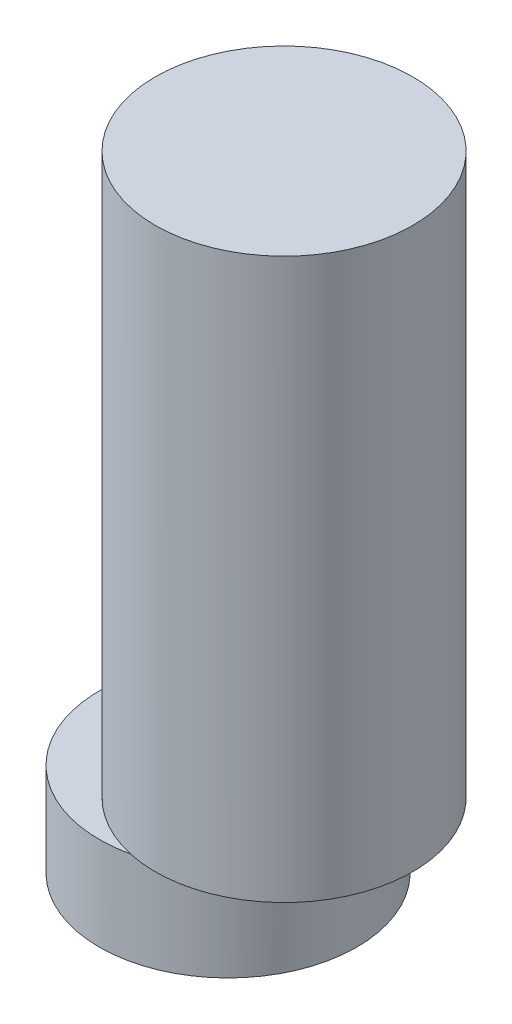
ISO-10303-21;
HEADER;
FILE_DESCRIPTION(('STEP AP214'),'2;1');
FILE_NAME('part.step','',(''),(''),'','','');
FILE_SCHEMA(('AUTOMOTIVE_DESIGN { 1 0 10303 214 1 1 1 1 }'));
ENDSEC;
DATA;
#1=APPLICATION_CONTEXT('core data for automotive mechanical design processes');
#2=APPLICATION_PROTOCOL_DEFINITION('international standard','automotive_design',2000,#1);
#3=PRODUCT_CONTEXT('',#1,'mechanical');
#4=PRODUCT('Part','Part','',(#3));
#5=PRODUCT_RELATED_PRODUCT_CATEGORY('part','',(#4));
#6=PRODUCT_DEFINITION_FORMATION('','',#4);
#7=PRODUCT_DEFINITION_CONTEXT('part definition',#1,'design');
#8=PRODUCT_DEFINITION('design','',#6,#7);
#9=PRODUCT_DEFINITION_SHAPE('','',#8);
#10=(LENGTH_UNIT() NAMED_UNIT(*) SI_UNIT(.MILLI.,.METRE.));
#11=(NAMED_UNIT(*) PLANE_ANGLE_UNIT() SI_UNIT($,.RADIAN.));
#12=(NAMED_UNIT(*) SI_UNIT($,.STERADIAN.) SOLID_ANGLE_UNIT());
#13=UNCERTAINTY_MEASURE_WITH_UNIT(LENGTH_MEASURE(1.E-05),#10,'distance_accuracy_value','');
#14=(GEOMETRIC_REPRESENTATION_CONTEXT(3) GLOBAL_UNCERTAINTY_ASSIGNED_CONTEXT((#13)) GLOBAL_UNIT_ASSIGNED_CONTEXT((#10,
#11,#12)) REPRESENTATION_CONTEXT('',''));
#15=CARTESIAN_POINT('',(0.,0.,0.));
#16=DIRECTION('',(0.,0.,1.));
#17=DIRECTION('',(1.,0.,0.));
#18=AXIS2_PLACEMENT_3D('',#15,#16,#17);
#19=CARTESIAN_POINT('',(0.,2.5,0.));
#20=DIRECTION('',(0.,-1.,0.));
#21=DIRECTION('',(0.,0.,-1.));
#22=AXIS2_PLACEMENT_3D('',#19,#20,#21);
#23=CYLINDRICAL_SURFACE('',#22,3.45);
#24=CARTESIAN_POINT('',(0.,2.5,0.));
#25=DIRECTION('',(0.,1.,0.));
#26=DIRECTION('',(0.,0.,1.));
#27=AXIS2_PLACEMENT_3D('',#24,#25,#26);
#28=CIRCLE('',#27,3.45);
#29=CARTESIAN_POINT('',(0.749999999999999,2.5,3.36749164809655));
#30=VERTEX_POINT('',#29);
#31=CARTESIAN_POINT('',(0.749999999999999,2.5,-3.36749164809655));
#32=VERTEX_POINT('',#31);
#33=EDGE_CURVE('E11',#30,#32,#28,.T.);
#34=ORIENTED_EDGE('',*,*,#33,.F.);
#35=EDGE_CURVE('E52',#32,#30,#28,.T.);
#36=ORIENTED_EDGE('',*,*,#35,.F.);
#37=EDGE_LOOP('',(#34,#36));
#38=FACE_BOUND('',#37,.T.);
#39=CARTESIAN_POINT('',(0.,0.,0.));
#40=DIRECTION('',(0.,1.,0.));
#41=DIRECTION('',(0.,0.,1.));
#42=AXIS2_PLACEMENT_3D('',#39,#40,#41);
#43=CIRCLE('',#42,3.45);
#44=CARTESIAN_POINT('',(0.,0.,3.45));
#45=VERTEX_POINT('',#44);
#46=EDGE_CURVE('E46',#45,#45,#43,.T.);
#47=ORIENTED_EDGE('',*,*,#46,.T.);
#48=EDGE_LOOP('',(#47));
#49=FACE_BOUND('',#48,.T.);
#50=ADVANCED_FACE('F43',(#38,#49),#23,.T.);
#51=CARTESIAN_POINT('',(0.,2.5,0.));
#52=DIRECTION('',(0.,1.,0.));
#53=DIRECTION('',(0.,0.,1.));
#54=AXIS2_PLACEMENT_3D('',#51,#52,#53);
#55=PLANE('',#54);
#56=CARTESIAN_POINT('',(1.5,2.5,0.));
#57=DIRECTION('',(0.,1.,0.));
#58=DIRECTION('',(0.,0.,1.));
#59=AXIS2_PLACEMENT_3D('',#56,#57,#58);
#60=CIRCLE('',#59,3.45);
#61=EDGE_CURVE('E58',#32,#30,#60,.T.);
#62=ORIENTED_EDGE('',*,*,#61,.F.);
#63=ORIENTED_EDGE('',*,*,#35,.T.);
#64=EDGE_LOOP('',(#62,#63));
#65=FACE_BOUND('',#64,.T.);
#66=ADVANCED_FACE('F66',(#65),#55,.T.);
#67=CARTESIAN_POINT('',(0.,0.,0.));
#68=DIRECTION('',(0.,1.,0.));
#69=DIRECTION('',(0.,0.,1.));
#70=AXIS2_PLACEMENT_3D('',#67,#68,#69);
#71=PLANE('',#70);
#72=ORIENTED_EDGE('',*,*,#46,.F.);
#73=EDGE_LOOP('',(#72));
#74=FACE_BOUND('',#73,.T.);
#75=ADVANCED_FACE('F85',(#74),#71,.F.);
#76=CARTESIAN_POINT('',(1.5,2.5,0.));
#77=DIRECTION('',(0.,1.,0.));
#78=DIRECTION('',(0.,0.,1.));
#79=AXIS2_PLACEMENT_3D('',#76,#77,#78);
#80=PLANE('',#79);
#81=EDGE_CURVE('E68',#30,#32,#60,.T.);
#82=ORIENTED_EDGE('',*,*,#81,.F.);
#83=ORIENTED_EDGE('',*,*,#33,.T.);
#84=EDGE_LOOP('',(#82,#83));
#85=FACE_BOUND('',#84,.T.);
#86=ADVANCED_FACE('F69',(#85),#80,.F.);
#87=CARTESIAN_POINT('',(1.5,17.5,0.));
#88=DIRECTION('',(0.,-1.,0.));
#89=DIRECTION('',(0.,0.,-1.));
#90=AXIS2_PLACEMENT_3D('',#87,#88,#89);
#91=CYLINDRICAL_SURFACE('',#90,3.45);
#92=CARTESIAN_POINT('',(1.5,17.5,0.));
#93=DIRECTION('',(0.,1.,0.));
#94=DIRECTION('',(0.,0.,1.));
#95=AXIS2_PLACEMENT_3D('',#92,#93,#94);
#96=CIRCLE('',#95,3.45);
#97=CARTESIAN_POINT('',(1.5,17.5,3.45));
#98=VERTEX_POINT('',#97);
#99=EDGE_CURVE('E75',#98,#98,#96,.T.);
#100=ORIENTED_EDGE('',*,*,#99,.F.);
#101=EDGE_LOOP('',(#100));
#102=FACE_BOUND('',#101,.T.);
#103=ORIENTED_EDGE('',*,*,#61,.T.);
#104=ORIENTED_EDGE('',*,*,#81,.T.);
#105=EDGE_LOOP('',(#103,#104));
#106=FACE_BOUND('',#105,.T.);
#107=ADVANCED_FACE('F73',(#102,#106),#91,.T.);
#108=CARTESIAN_POINT('',(1.5,17.5,0.));
#109=DIRECTION('',(0.,1.,0.));
#110=DIRECTION('',(0.,0.,1.));
#111=AXIS2_PLACEMENT_3D('',#108,#109,#110);
#112=PLANE('',#111);
#113=ORIENTED_EDGE('',*,*,#99,.T.);
#114=EDGE_LOOP('',(#113));
#115=FACE_BOUND('',#114,.T.);
#116=ADVANCED_FACE('F118',(#115),#112,.T.);
#117=CLOSED_SHELL('',(#50,#66,#75,#86,#107,#116));
#118=MANIFOLD_SOLID_BREP('B2',#117);
#119=ADVANCED_BREP_SHAPE_REPRESENTATION('',(#18,#118),#14);
#120=SHAPE_DEFINITION_REPRESENTATION(#9,#119);
ENDSEC;
END-ISO-10303-21;
